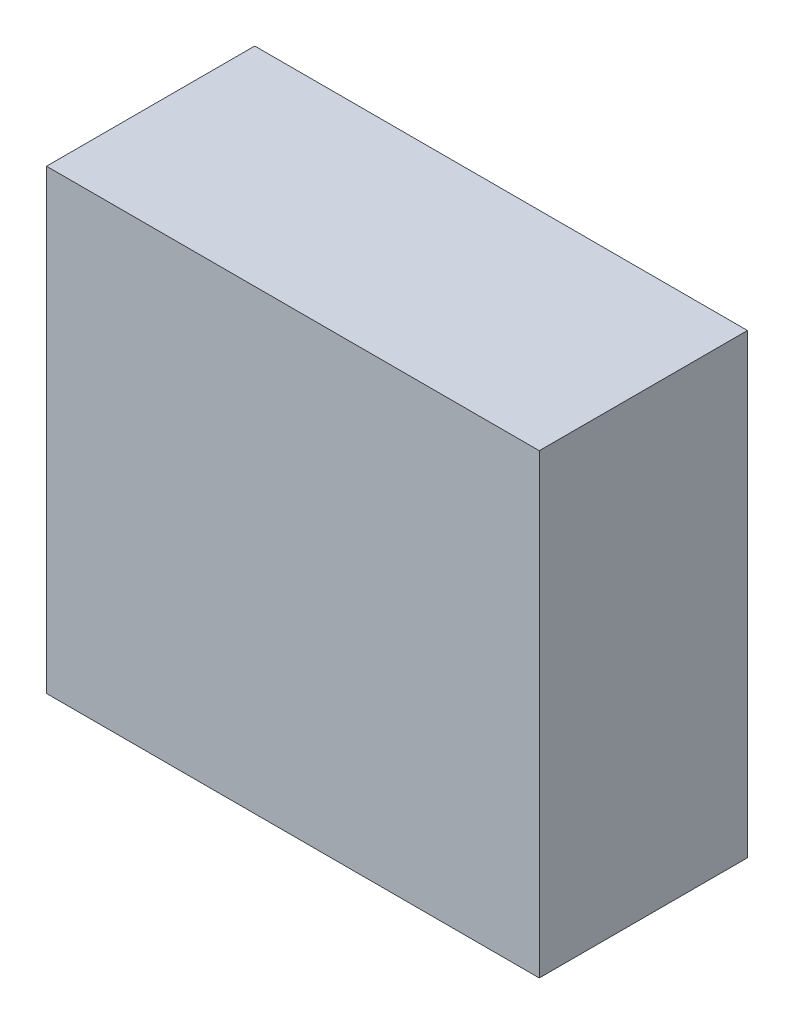
ISO-10303-21;
HEADER;
FILE_DESCRIPTION(('STEP AP214'),'2;1');
FILE_NAME('part.step','',(''),(''),'','','');
FILE_SCHEMA(('AUTOMOTIVE_DESIGN { 1 0 10303 214 1 1 1 1 }'));
ENDSEC;
DATA;
#1=APPLICATION_CONTEXT('core data for automotive mechanical design processes');
#2=APPLICATION_PROTOCOL_DEFINITION('international standard','automotive_design',2000,#1);
#3=PRODUCT_CONTEXT('',#1,'mechanical');
#4=PRODUCT('Part','Part','',(#3));
#5=PRODUCT_RELATED_PRODUCT_CATEGORY('part','',(#4));
#6=PRODUCT_DEFINITION_FORMATION('','',#4);
#7=PRODUCT_DEFINITION_CONTEXT('part definition',#1,'design');
#8=PRODUCT_DEFINITION('design','',#6,#7);
#9=PRODUCT_DEFINITION_SHAPE('','',#8);
#10=(LENGTH_UNIT() NAMED_UNIT(*) SI_UNIT(.MILLI.,.METRE.));
#11=(NAMED_UNIT(*) PLANE_ANGLE_UNIT() SI_UNIT($,.RADIAN.));
#12=(NAMED_UNIT(*) SI_UNIT($,.STERADIAN.) SOLID_ANGLE_UNIT());
#13=UNCERTAINTY_MEASURE_WITH_UNIT(LENGTH_MEASURE(1.E-05),#10,'distance_accuracy_value','');
#14=(GEOMETRIC_REPRESENTATION_CONTEXT(3) GLOBAL_UNCERTAINTY_ASSIGNED_CONTEXT((#13)) GLOBAL_UNIT_ASSIGNED_CONTEXT((#10,
#11,#12)) REPRESENTATION_CONTEXT('',''));
#15=CARTESIAN_POINT('',(0.,0.,0.));
#16=DIRECTION('',(0.,0.,1.));
#17=DIRECTION('',(1.,0.,0.));
#18=AXIS2_PLACEMENT_3D('',#15,#16,#17);
#19=CARTESIAN_POINT('',(0.,167.132,0.));
#20=DIRECTION('',(1.,0.,0.));
#21=DIRECTION('',(0.,0.,-1.));
#22=AXIS2_PLACEMENT_3D('',#19,#20,#21);
#23=PLANE('',#22);
#24=DIRECTION('',(0.,0.,1.));
#25=VECTOR('',#24,1.);
#26=CARTESIAN_POINT('',(0.,0.,0.));
#27=LINE('',#26,#25);
#28=CARTESIAN_POINT('',(0.,0.,-76.2));
#29=VERTEX_POINT('',#28);
#30=CARTESIAN_POINT('',(0.,0.,0.));
#31=VERTEX_POINT('',#30);
#32=EDGE_CURVE('E96',#29,#31,#27,.T.);
#33=ORIENTED_EDGE('',*,*,#32,.T.);
#34=DIRECTION('',(0.,-1.,0.));
#35=VECTOR('',#34,1.);
#36=CARTESIAN_POINT('',(0.,167.132,0.));
#37=LINE('',#36,#35);
#38=CARTESIAN_POINT('',(0.,167.132,0.));
#39=VERTEX_POINT('',#38);
#40=EDGE_CURVE('E11',#39,#31,#37,.T.);
#41=ORIENTED_EDGE('',*,*,#40,.F.);
#42=DIRECTION('',(0.,0.,1.));
#43=VECTOR('',#42,1.);
#44=CARTESIAN_POINT('',(0.,167.132,0.));
#45=LINE('',#44,#43);
#46=CARTESIAN_POINT('',(0.,167.132,-76.2));
#47=VERTEX_POINT('',#46);
#48=EDGE_CURVE('E84',#47,#39,#45,.T.);
#49=ORIENTED_EDGE('',*,*,#48,.F.);
#50=DIRECTION('',(0.,-1.,0.));
#51=VECTOR('',#50,1.);
#52=CARTESIAN_POINT('',(0.,167.132,-76.2));
#53=LINE('',#52,#51);
#54=EDGE_CURVE('E92',#47,#29,#53,.T.);
#55=ORIENTED_EDGE('',*,*,#54,.T.);
#56=EDGE_LOOP('',(#33,#41,#49,#55));
#57=FACE_BOUND('',#56,.T.);
#58=ADVANCED_FACE('F33',(#57),#23,.F.);
#59=CARTESIAN_POINT('',(0.,167.132,0.));
#60=DIRECTION('',(0.,0.,-1.));
#61=DIRECTION('',(-1.,0.,0.));
#62=AXIS2_PLACEMENT_3D('',#59,#60,#61);
#63=PLANE('',#62);
#64=DIRECTION('',(1.,0.,0.));
#65=VECTOR('',#64,1.);
#66=CARTESIAN_POINT('',(0.,0.,0.));
#67=LINE('',#66,#65);
#68=CARTESIAN_POINT('',(180.34,0.,0.));
#69=VERTEX_POINT('',#68);
#70=EDGE_CURVE('E88',#31,#69,#67,.T.);
#71=ORIENTED_EDGE('',*,*,#70,.T.);
#72=DIRECTION('',(0.,-1.,0.));
#73=VECTOR('',#72,1.);
#74=CARTESIAN_POINT('',(180.34,167.132,0.));
#75=LINE('',#74,#73);
#76=CARTESIAN_POINT('',(180.34,167.132,0.));
#77=VERTEX_POINT('',#76);
#78=EDGE_CURVE('E41',#77,#69,#75,.T.);
#79=ORIENTED_EDGE('',*,*,#78,.F.);
#80=DIRECTION('',(1.,0.,0.));
#81=VECTOR('',#80,1.);
#82=CARTESIAN_POINT('',(0.,167.132,0.));
#83=LINE('',#82,#81);
#84=EDGE_CURVE('E79',#39,#77,#83,.T.);
#85=ORIENTED_EDGE('',*,*,#84,.F.);
#86=ORIENTED_EDGE('',*,*,#40,.T.);
#87=EDGE_LOOP('',(#71,#79,#85,#86));
#88=FACE_BOUND('',#87,.T.);
#89=ADVANCED_FACE('F87',(#88),#63,.F.);
#90=CARTESIAN_POINT('',(180.34,167.132,0.));
#91=DIRECTION('',(-1.,0.,0.));
#92=DIRECTION('',(0.,0.,1.));
#93=AXIS2_PLACEMENT_3D('',#90,#91,#92);
#94=PLANE('',#93);
#95=DIRECTION('',(0.,0.,-1.));
#96=VECTOR('',#95,1.);
#97=CARTESIAN_POINT('',(180.34,0.,0.));
#98=LINE('',#97,#96);
#99=CARTESIAN_POINT('',(180.34,0.,-76.2));
#100=VERTEX_POINT('',#99);
#101=EDGE_CURVE('E66',#69,#100,#98,.T.);
#102=ORIENTED_EDGE('',*,*,#101,.T.);
#103=DIRECTION('',(0.,-1.,0.));
#104=VECTOR('',#103,1.);
#105=CARTESIAN_POINT('',(180.34,167.132,-76.2));
#106=LINE('',#105,#104);
#107=CARTESIAN_POINT('',(180.34,167.132,-76.2));
#108=VERTEX_POINT('',#107);
#109=EDGE_CURVE('E89',#108,#100,#106,.T.);
#110=ORIENTED_EDGE('',*,*,#109,.F.);
#111=DIRECTION('',(0.,0.,-1.));
#112=VECTOR('',#111,1.);
#113=CARTESIAN_POINT('',(180.34,167.132,0.));
#114=LINE('',#113,#112);
#115=EDGE_CURVE('E82',#77,#108,#114,.T.);
#116=ORIENTED_EDGE('',*,*,#115,.F.);
#117=ORIENTED_EDGE('',*,*,#78,.T.);
#118=EDGE_LOOP('',(#102,#110,#116,#117));
#119=FACE_BOUND('',#118,.T.);
#120=ADVANCED_FACE('F90',(#119),#94,.F.);
#121=CARTESIAN_POINT('',(0.,167.132,-76.2));
#122=DIRECTION('',(0.,0.,1.));
#123=DIRECTION('',(1.,0.,0.));
#124=AXIS2_PLACEMENT_3D('',#121,#122,#123);
#125=PLANE('',#124);
#126=DIRECTION('',(-1.,0.,0.));
#127=VECTOR('',#126,1.);
#128=CARTESIAN_POINT('',(0.,0.,-76.2));
#129=LINE('',#128,#127);
#130=EDGE_CURVE('E72',#100,#29,#129,.T.);
#131=ORIENTED_EDGE('',*,*,#130,.T.);
#132=ORIENTED_EDGE('',*,*,#54,.F.);
#133=DIRECTION('',(-1.,0.,0.));
#134=VECTOR('',#133,1.);
#135=CARTESIAN_POINT('',(0.,167.132,-76.2));
#136=LINE('',#135,#134);
#137=EDGE_CURVE('E49',#108,#47,#136,.T.);
#138=ORIENTED_EDGE('',*,*,#137,.F.);
#139=ORIENTED_EDGE('',*,*,#109,.T.);
#140=EDGE_LOOP('',(#131,#132,#138,#139));
#141=FACE_BOUND('',#140,.T.);
#142=ADVANCED_FACE('F103',(#141),#125,.F.);
#143=CARTESIAN_POINT('',(0.,167.132,0.));
#144=DIRECTION('',(0.,-1.,0.));
#145=DIRECTION('',(0.,0.,-1.));
#146=AXIS2_PLACEMENT_3D('',#143,#144,#145);
#147=PLANE('',#146);
#148=ORIENTED_EDGE('',*,*,#48,.T.);
#149=ORIENTED_EDGE('',*,*,#84,.T.);
#150=ORIENTED_EDGE('',*,*,#115,.T.);
#151=ORIENTED_EDGE('',*,*,#137,.T.);
#152=EDGE_LOOP('',(#148,#149,#150,#151));
#153=FACE_BOUND('',#152,.T.);
#154=ADVANCED_FACE('F80',(#153),#147,.F.);
#155=CARTESIAN_POINT('',(0.,0.,0.));
#156=DIRECTION('',(0.,-1.,0.));
#157=DIRECTION('',(0.,0.,-1.));
#158=AXIS2_PLACEMENT_3D('',#155,#156,#157);
#159=PLANE('',#158);
#160=ORIENTED_EDGE('',*,*,#32,.F.);
#161=ORIENTED_EDGE('',*,*,#130,.F.);
#162=ORIENTED_EDGE('',*,*,#101,.F.);
#163=ORIENTED_EDGE('',*,*,#70,.F.);
#164=EDGE_LOOP('',(#160,#161,#162,#163));
#165=FACE_BOUND('',#164,.T.);
#166=ADVANCED_FACE('F106',(#165),#159,.T.);
#167=CLOSED_SHELL('',(#58,#89,#120,#142,#154,#166));
#168=MANIFOLD_SOLID_BREP('B2',#167);
#169=ADVANCED_BREP_SHAPE_REPRESENTATION('',(#18,#168),#14);
#170=SHAPE_DEFINITION_REPRESENTATION(#9,#169);
ENDSEC;
END-ISO-10303-21;
